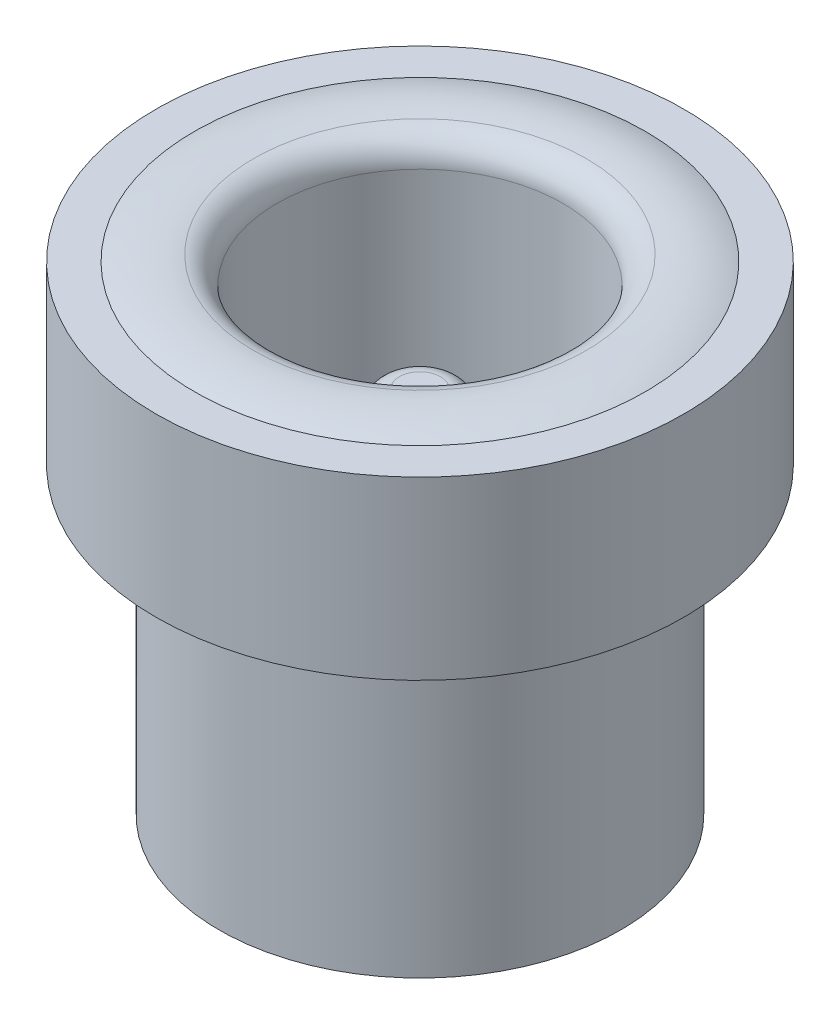
ISO-10303-21;
HEADER;
FILE_DESCRIPTION(('STEP AP214'),'2;1');
FILE_NAME('part.step','',(''),(''),'','','');
FILE_SCHEMA(('AUTOMOTIVE_DESIGN { 1 0 10303 214 1 1 1 1 }'));
ENDSEC;
DATA;
#1=APPLICATION_CONTEXT('core data for automotive mechanical design processes');
#2=APPLICATION_PROTOCOL_DEFINITION('international standard','automotive_design',2000,#1);
#3=PRODUCT_CONTEXT('',#1,'mechanical');
#4=PRODUCT('Part','Part','',(#3));
#5=PRODUCT_RELATED_PRODUCT_CATEGORY('part','',(#4));
#6=PRODUCT_DEFINITION_FORMATION('','',#4);
#7=PRODUCT_DEFINITION_CONTEXT('part definition',#1,'design');
#8=PRODUCT_DEFINITION('design','',#6,#7);
#9=PRODUCT_DEFINITION_SHAPE('','',#8);
#10=(LENGTH_UNIT() NAMED_UNIT(*) SI_UNIT(.MILLI.,.METRE.));
#11=(NAMED_UNIT(*) PLANE_ANGLE_UNIT() SI_UNIT($,.RADIAN.));
#12=(NAMED_UNIT(*) SI_UNIT($,.STERADIAN.) SOLID_ANGLE_UNIT());
#13=UNCERTAINTY_MEASURE_WITH_UNIT(LENGTH_MEASURE(1.E-05),#10,'distance_accuracy_value','');
#14=(GEOMETRIC_REPRESENTATION_CONTEXT(3) GLOBAL_UNCERTAINTY_ASSIGNED_CONTEXT((#13)) GLOBAL_UNIT_ASSIGNED_CONTEXT((#10,
#11,#12)) REPRESENTATION_CONTEXT('',''));
#15=CARTESIAN_POINT('',(0.,0.,0.));
#16=DIRECTION('',(0.,0.,1.));
#17=DIRECTION('',(1.,0.,0.));
#18=AXIS2_PLACEMENT_3D('',#15,#16,#17);
#19=CARTESIAN_POINT('',(0.,3.2,0.));
#20=DIRECTION('',(0.,1.,0.));
#21=DIRECTION('',(0.,0.,1.));
#22=AXIS2_PLACEMENT_3D('',#19,#20,#21);
#23=PLANE('',#22);
#24=CARTESIAN_POINT('',(0.,3.2,0.));
#25=DIRECTION('',(0.,1.,0.));
#26=DIRECTION('',(0.,0.,1.));
#27=AXIS2_PLACEMENT_3D('',#24,#25,#26);
#28=CIRCLE('',#27,4.8);
#29=CARTESIAN_POINT('',(0.,3.2,4.8));
#30=VERTEX_POINT('',#29);
#31=EDGE_CURVE('E68',#30,#30,#28,.T.);
#32=ORIENTED_EDGE('',*,*,#31,.T.);
#33=EDGE_LOOP('',(#32));
#34=FACE_BOUND('',#33,.T.);
#35=CARTESIAN_POINT('',(0.,3.2,0.));
#36=DIRECTION('',(0.,-1.,0.));
#37=DIRECTION('',(0.,0.,-1.));
#38=AXIS2_PLACEMENT_3D('',#35,#36,#37);
#39=CIRCLE('',#38,4.1);
#40=CARTESIAN_POINT('',(0.,3.2,-4.1));
#41=VERTEX_POINT('',#40);
#42=EDGE_CURVE('E83',#41,#41,#39,.T.);
#43=ORIENTED_EDGE('',*,*,#42,.T.);
#44=EDGE_LOOP('',(#43));
#45=FACE_BOUND('',#44,.T.);
#46=ADVANCED_FACE('F39',(#34,#45),#23,.T.);
#47=CARTESIAN_POINT('',(0.,3.2,0.));
#48=DIRECTION('',(0.,-1.,0.));
#49=DIRECTION('',(0.,0.,-1.));
#50=AXIS2_PLACEMENT_3D('',#47,#48,#49);
#51=CYLINDRICAL_SURFACE('',#50,4.8);
#52=ORIENTED_EDGE('',*,*,#31,.F.);
#53=EDGE_LOOP('',(#52));
#54=FACE_BOUND('',#53,.T.);
#55=CARTESIAN_POINT('',(0.,0.,0.));
#56=DIRECTION('',(0.,1.,0.));
#57=DIRECTION('',(0.,0.,1.));
#58=AXIS2_PLACEMENT_3D('',#55,#56,#57);
#59=CIRCLE('',#58,4.8);
#60=CARTESIAN_POINT('',(0.,0.,4.8));
#61=VERTEX_POINT('',#60);
#62=EDGE_CURVE('E64',#61,#61,#59,.T.);
#63=ORIENTED_EDGE('',*,*,#62,.T.);
#64=EDGE_LOOP('',(#63));
#65=FACE_BOUND('',#64,.T.);
#66=ADVANCED_FACE('F112',(#54,#65),#51,.T.);
#67=CARTESIAN_POINT('',(0.,0.,0.));
#68=DIRECTION('',(0.,1.,0.));
#69=DIRECTION('',(0.,0.,1.));
#70=AXIS2_PLACEMENT_3D('',#67,#68,#69);
#71=PLANE('',#70);
#72=CARTESIAN_POINT('',(0.,0.,0.));
#73=DIRECTION('',(0.,-1.,0.));
#74=DIRECTION('',(0.,0.,-1.));
#75=AXIS2_PLACEMENT_3D('',#72,#73,#74);
#76=CIRCLE('',#75,3.65);
#77=CARTESIAN_POINT('',(0.,0.,-3.65));
#78=VERTEX_POINT('',#77);
#79=EDGE_CURVE('E63',#78,#78,#76,.T.);
#80=ORIENTED_EDGE('',*,*,#79,.F.);
#81=EDGE_LOOP('',(#80));
#82=FACE_BOUND('',#81,.T.);
#83=ORIENTED_EDGE('',*,*,#62,.F.);
#84=EDGE_LOOP('',(#83));
#85=FACE_BOUND('',#84,.T.);
#86=ADVANCED_FACE('F118',(#82,#85),#71,.F.);
#87=CARTESIAN_POINT('',(0.,-5.5,0.));
#88=DIRECTION('',(0.,1.,0.));
#89=DIRECTION('',(0.,0.,1.));
#90=AXIS2_PLACEMENT_3D('',#87,#88,#89);
#91=CYLINDRICAL_SURFACE('',#90,3.65);
#92=CARTESIAN_POINT('',(0.,-5.5,0.));
#93=DIRECTION('',(0.,-1.,0.));
#94=DIRECTION('',(0.,0.,-1.));
#95=AXIS2_PLACEMENT_3D('',#92,#93,#94);
#96=CIRCLE('',#95,3.65);
#97=CARTESIAN_POINT('',(0.,-5.5,-3.65));
#98=VERTEX_POINT('',#97);
#99=EDGE_CURVE('E69',#98,#98,#96,.T.);
#100=ORIENTED_EDGE('',*,*,#99,.F.);
#101=EDGE_LOOP('',(#100));
#102=FACE_BOUND('',#101,.T.);
#103=ORIENTED_EDGE('',*,*,#79,.T.);
#104=EDGE_LOOP('',(#103));
#105=FACE_BOUND('',#104,.T.);
#106=ADVANCED_FACE('F124',(#102,#105),#91,.T.);
#107=CARTESIAN_POINT('',(0.,-5.5,0.));
#108=DIRECTION('',(0.,-1.,0.));
#109=DIRECTION('',(0.,0.,-1.));
#110=AXIS2_PLACEMENT_3D('',#107,#108,#109);
#111=PLANE('',#110);
#112=ORIENTED_EDGE('',*,*,#99,.T.);
#113=EDGE_LOOP('',(#112));
#114=FACE_BOUND('',#113,.T.);
#115=ADVANCED_FACE('F130',(#114),#111,.T.);
#116=CARTESIAN_POINT('',(0.,1.2,0.));
#117=DIRECTION('',(0.,-1.,0.));
#118=DIRECTION('',(0.,0.,-1.));
#119=AXIS2_PLACEMENT_3D('',#116,#117,#118);
#120=TOROIDAL_SURFACE('',#119,3.35,2.13600093632938);
#121=CARTESIAN_POINT('',(0.,3.31091431325414,0.));
#122=DIRECTION('',(0.,-1.,0.));
#123=DIRECTION('',(0.,0.,-1.));
#124=AXIS2_PLACEMENT_3D('',#121,#122,#123);
#125=CIRCLE('',#124,3.02359417575857);
#126=CARTESIAN_POINT('',(0.,3.31091431325414,-3.02359417575857));
#127=VERTEX_POINT('',#126);
#128=EDGE_CURVE('E57',#127,#127,#125,.T.);
#129=ORIENTED_EDGE('',*,*,#128,.T.);
#130=EDGE_LOOP('',(#129));
#131=FACE_BOUND('',#130,.T.);
#132=ORIENTED_EDGE('',*,*,#42,.F.);
#133=EDGE_LOOP('',(#132));
#134=FACE_BOUND('',#133,.T.);
#135=ADVANCED_FACE('F98',(#131,#134),#120,.T.);
#136=CARTESIAN_POINT('',(0.,-4.8,0.));
#137=DIRECTION('',(0.,1.,0.));
#138=DIRECTION('',(0.,0.,1.));
#139=AXIS2_PLACEMENT_3D('',#136,#137,#138);
#140=PLANE('',#139);
#141=CARTESIAN_POINT('',(0.,-4.8,0.));
#142=DIRECTION('',(0.,1.,0.));
#143=DIRECTION('',(0.,0.,1.));
#144=AXIS2_PLACEMENT_3D('',#141,#142,#143);
#145=CIRCLE('',#144,0.75);
#146=CARTESIAN_POINT('',(0.,-4.8,0.75));
#147=VERTEX_POINT('',#146);
#148=EDGE_CURVE('E87',#147,#147,#145,.T.);
#149=ORIENTED_EDGE('',*,*,#148,.F.);
#150=EDGE_LOOP('',(#149));
#151=FACE_BOUND('',#150,.T.);
#152=CARTESIAN_POINT('',(0.,-4.8,0.));
#153=DIRECTION('',(0.,1.,0.));
#154=DIRECTION('',(0.,0.,1.));
#155=AXIS2_PLACEMENT_3D('',#152,#153,#154);
#156=CIRCLE('',#155,2.6);
#157=CARTESIAN_POINT('',(0.,-4.8,2.6));
#158=VERTEX_POINT('',#157);
#159=EDGE_CURVE('E79',#158,#158,#156,.T.);
#160=ORIENTED_EDGE('',*,*,#159,.T.);
#161=EDGE_LOOP('',(#160));
#162=FACE_BOUND('',#161,.T.);
#163=ADVANCED_FACE('F94',(#151,#162),#140,.T.);
#164=CARTESIAN_POINT('',(0.,-4.8,0.));
#165=DIRECTION('',(0.,1.,0.));
#166=DIRECTION('',(0.,0.,1.));
#167=AXIS2_PLACEMENT_3D('',#164,#165,#166);
#168=CYLINDRICAL_SURFACE('',#167,2.6);
#169=CARTESIAN_POINT('',(0.,2.81678664754216,0.));
#170=DIRECTION('',(0.,1.,0.));
#171=DIRECTION('',(0.,0.,1.));
#172=AXIS2_PLACEMENT_3D('',#169,#170,#171);
#173=CIRCLE('',#172,2.6);
#174=CARTESIAN_POINT('',(0.,2.81678664754216,2.6));
#175=VERTEX_POINT('',#174);
#176=EDGE_CURVE('E52',#175,#175,#173,.T.);
#177=ORIENTED_EDGE('',*,*,#176,.T.);
#178=EDGE_LOOP('',(#177));
#179=FACE_BOUND('',#178,.T.);
#180=ORIENTED_EDGE('',*,*,#159,.F.);
#181=EDGE_LOOP('',(#180));
#182=FACE_BOUND('',#181,.T.);
#183=ADVANCED_FACE('F97',(#179,#182),#168,.F.);
#184=CARTESIAN_POINT('',(0.,2.81678664754216,0.));
#185=DIRECTION('',(0.,1.,0.));
#186=DIRECTION('',(0.,0.,1.));
#187=AXIS2_PLACEMENT_3D('',#184,#185,#186);
#188=TOROIDAL_SURFACE('',#187,3.1,0.5);
#189=ORIENTED_EDGE('',*,*,#176,.F.);
#190=EDGE_LOOP('',(#189));
#191=FACE_BOUND('',#190,.T.);
#192=ORIENTED_EDGE('',*,*,#128,.F.);
#193=EDGE_LOOP('',(#192));
#194=FACE_BOUND('',#193,.T.);
#195=ADVANCED_FACE('F103',(#191,#194),#188,.T.);
#196=CARTESIAN_POINT('',(0.,1.2,0.));
#197=DIRECTION('',(0.,-1.,0.));
#198=DIRECTION('',(0.,0.,-1.));
#199=AXIS2_PLACEMENT_3D('',#196,#197,#198);
#200=CYLINDRICAL_SURFACE('',#199,0.75);
#201=CARTESIAN_POINT('',(0.,0.825,0.));
#202=DIRECTION('',(0.,1.,0.));
#203=DIRECTION('',(0.,0.,1.));
#204=AXIS2_PLACEMENT_3D('',#201,#202,#203);
#205=CIRCLE('',#204,0.75);
#206=CARTESIAN_POINT('',(0.,0.825,0.75));
#207=VERTEX_POINT('',#206);
#208=EDGE_CURVE('E10',#207,#207,#205,.F.);
#209=ORIENTED_EDGE('',*,*,#208,.T.);
#210=EDGE_LOOP('',(#209));
#211=FACE_BOUND('',#210,.T.);
#212=ORIENTED_EDGE('',*,*,#148,.T.);
#213=EDGE_LOOP('',(#212));
#214=FACE_BOUND('',#213,.T.);
#215=ADVANCED_FACE('F92',(#211,#214),#200,.T.);
#216=CARTESIAN_POINT('',(0.,1.2,0.));
#217=DIRECTION('',(0.,1.,0.));
#218=DIRECTION('',(0.,0.,1.));
#219=AXIS2_PLACEMENT_3D('',#216,#217,#218);
#220=PLANE('',#219);
#221=CARTESIAN_POINT('',(0.,1.2,0.));
#222=DIRECTION('',(0.,1.,0.));
#223=DIRECTION('',(0.,0.,1.));
#224=AXIS2_PLACEMENT_3D('',#221,#222,#223);
#225=CIRCLE('',#224,0.375);
#226=CARTESIAN_POINT('',(0.,1.2,0.375));
#227=VERTEX_POINT('',#226);
#228=EDGE_CURVE('E47',#227,#227,#225,.T.);
#229=ORIENTED_EDGE('',*,*,#228,.T.);
#230=EDGE_LOOP('',(#229));
#231=FACE_BOUND('',#230,.T.);
#232=ADVANCED_FACE('F153',(#231),#220,.T.);
#233=CARTESIAN_POINT('',(0.,0.825,0.));
#234=DIRECTION('',(0.,1.,0.));
#235=DIRECTION('',(0.,0.,1.));
#236=AXIS2_PLACEMENT_3D('',#233,#234,#235);
#237=TOROIDAL_SURFACE('',#236,0.375,0.375);
#238=ORIENTED_EDGE('',*,*,#208,.F.);
#239=EDGE_LOOP('',(#238));
#240=FACE_BOUND('',#239,.T.);
#241=ORIENTED_EDGE('',*,*,#228,.F.);
#242=EDGE_LOOP('',(#241));
#243=FACE_BOUND('',#242,.T.);
#244=ADVANCED_FACE('F41',(#240,#243),#237,.T.);
#245=CLOSED_SHELL('',(#46,#66,#86,#106,#115,#135,#163,#183,#195,#215,#232,#244));
#246=MANIFOLD_SOLID_BREP('B2',#245);
#247=ADVANCED_BREP_SHAPE_REPRESENTATION('',(#18,#246),#14);
#248=SHAPE_DEFINITION_REPRESENTATION(#9,#247);
ENDSEC;
END-ISO-10303-21;
